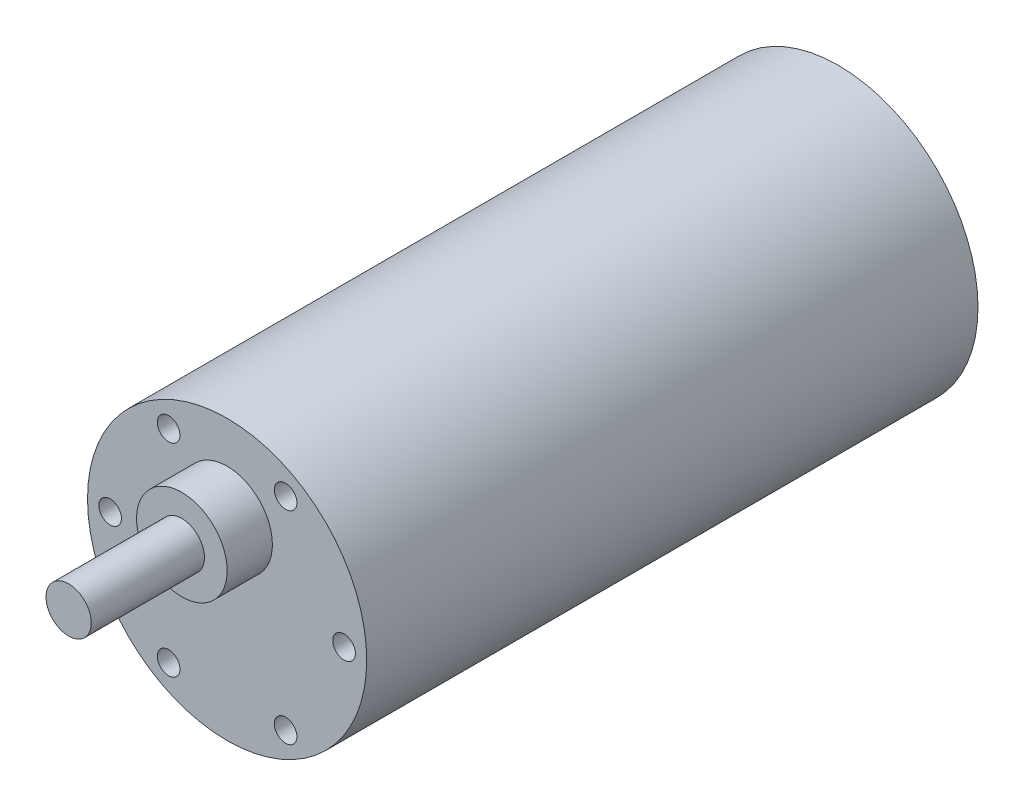
ISO-10303-21;
HEADER;
FILE_DESCRIPTION(('STEP AP214'),'2;1');
FILE_NAME('part.step','',(''),(''),'','','');
FILE_SCHEMA(('AUTOMOTIVE_DESIGN { 1 0 10303 214 1 1 1 1 }'));
ENDSEC;
DATA;
#1=APPLICATION_CONTEXT('core data for automotive mechanical design processes');
#2=APPLICATION_PROTOCOL_DEFINITION('international standard','automotive_design',2000,#1);
#3=PRODUCT_CONTEXT('',#1,'mechanical');
#4=PRODUCT('Part','Part','',(#3));
#5=PRODUCT_RELATED_PRODUCT_CATEGORY('part','',(#4));
#6=PRODUCT_DEFINITION_FORMATION('','',#4);
#7=PRODUCT_DEFINITION_CONTEXT('part definition',#1,'design');
#8=PRODUCT_DEFINITION('design','',#6,#7);
#9=PRODUCT_DEFINITION_SHAPE('','',#8);
#10=(LENGTH_UNIT() NAMED_UNIT(*) SI_UNIT(.MILLI.,.METRE.));
#11=(NAMED_UNIT(*) PLANE_ANGLE_UNIT() SI_UNIT($,.RADIAN.));
#12=(NAMED_UNIT(*) SI_UNIT($,.STERADIAN.) SOLID_ANGLE_UNIT());
#13=UNCERTAINTY_MEASURE_WITH_UNIT(LENGTH_MEASURE(1.E-05),#10,'distance_accuracy_value','');
#14=(GEOMETRIC_REPRESENTATION_CONTEXT(3) GLOBAL_UNCERTAINTY_ASSIGNED_CONTEXT((#13)) GLOBAL_UNIT_ASSIGNED_CONTEXT((#10,
#11,#12)) REPRESENTATION_CONTEXT('',''));
#15=CARTESIAN_POINT('',(0.,0.,0.));
#16=DIRECTION('',(0.,0.,1.));
#17=DIRECTION('',(1.,0.,0.));
#18=AXIS2_PLACEMENT_3D('',#15,#16,#17);
#19=CARTESIAN_POINT('',(0.,0.,24.));
#20=DIRECTION('',(0.,0.,-1.));
#21=DIRECTION('',(-1.,0.,0.));
#22=AXIS2_PLACEMENT_3D('',#19,#20,#21);
#23=CYLINDRICAL_SURFACE('',#22,18.5);
#24=CARTESIAN_POINT('',(0.,0.,24.));
#25=DIRECTION('',(0.,0.,1.));
#26=DIRECTION('',(1.,0.,0.));
#27=AXIS2_PLACEMENT_3D('',#24,#25,#26);
#28=CIRCLE('',#27,18.5);
#29=CARTESIAN_POINT('',(18.5,0.,24.));
#30=VERTEX_POINT('',#29);
#31=EDGE_CURVE('E10',#30,#30,#28,.T.);
#32=ORIENTED_EDGE('',*,*,#31,.F.);
#33=EDGE_LOOP('',(#32));
#34=FACE_BOUND('',#33,.T.);
#35=CARTESIAN_POINT('',(0.,0.,-57.));
#36=DIRECTION('',(0.,0.,1.));
#37=DIRECTION('',(1.,0.,0.));
#38=AXIS2_PLACEMENT_3D('',#35,#36,#37);
#39=CIRCLE('',#38,18.5);
#40=CARTESIAN_POINT('',(18.5,0.,-57.));
#41=VERTEX_POINT('',#40);
#42=EDGE_CURVE('E44',#41,#41,#39,.T.);
#43=ORIENTED_EDGE('',*,*,#42,.T.);
#44=EDGE_LOOP('',(#43));
#45=FACE_BOUND('',#44,.T.);
#46=ADVANCED_FACE('F37',(#34,#45),#23,.T.);
#47=CARTESIAN_POINT('',(0.,0.,24.));
#48=DIRECTION('',(0.,0.,1.));
#49=DIRECTION('',(1.,0.,0.));
#50=AXIS2_PLACEMENT_3D('',#47,#48,#49);
#51=PLANE('',#50);
#52=CARTESIAN_POINT('',(0.,7.,24.));
#53=DIRECTION('',(0.,0.,1.));
#54=DIRECTION('',(1.,0.,0.));
#55=AXIS2_PLACEMENT_3D('',#52,#53,#54);
#56=CIRCLE('',#55,6.);
#57=CARTESIAN_POINT('',(6.,7.,24.));
#58=VERTEX_POINT('',#57);
#59=EDGE_CURVE('E101',#58,#58,#56,.T.);
#60=ORIENTED_EDGE('',*,*,#59,.F.);
#61=EDGE_LOOP('',(#60));
#62=FACE_BOUND('',#61,.T.);
#63=CARTESIAN_POINT('',(15.5,0.,24.));
#64=DIRECTION('',(0.,0.,1.));
#65=DIRECTION('',(1.,0.,0.));
#66=AXIS2_PLACEMENT_3D('',#63,#64,#65);
#67=CIRCLE('',#66,1.5);
#68=CARTESIAN_POINT('',(17.,0.,24.));
#69=VERTEX_POINT('',#68);
#70=EDGE_CURVE('E54',#69,#69,#67,.T.);
#71=ORIENTED_EDGE('',*,*,#70,.F.);
#72=EDGE_LOOP('',(#71));
#73=FACE_BOUND('',#72,.T.);
#74=CARTESIAN_POINT('',(7.75000000000016,13.4233937586587,24.));
#75=DIRECTION('',(0.,0.,1.));
#76=DIRECTION('',(1.,0.,0.));
#77=AXIS2_PLACEMENT_3D('',#74,#75,#76);
#78=CIRCLE('',#77,1.5);
#79=CARTESIAN_POINT('',(9.25000000000016,13.4233937586587,24.));
#80=VERTEX_POINT('',#79);
#81=EDGE_CURVE('E90',#80,#80,#78,.T.);
#82=ORIENTED_EDGE('',*,*,#81,.F.);
#83=EDGE_LOOP('',(#82));
#84=FACE_BOUND('',#83,.T.);
#85=CARTESIAN_POINT('',(-7.74999999999987,13.4233937586589,24.));
#86=DIRECTION('',(0.,0.,1.));
#87=DIRECTION('',(1.,0.,0.));
#88=AXIS2_PLACEMENT_3D('',#85,#86,#87);
#89=CIRCLE('',#88,1.5);
#90=CARTESIAN_POINT('',(-6.24999999999988,13.4233937586589,24.));
#91=VERTEX_POINT('',#90);
#92=EDGE_CURVE('E57',#91,#91,#89,.T.);
#93=ORIENTED_EDGE('',*,*,#92,.F.);
#94=EDGE_LOOP('',(#93));
#95=FACE_BOUND('',#94,.T.);
#96=CARTESIAN_POINT('',(-15.5,1.08235921504137E-13,24.));
#97=DIRECTION('',(0.,0.,1.));
#98=DIRECTION('',(1.,0.,0.));
#99=AXIS2_PLACEMENT_3D('',#96,#97,#98);
#100=CIRCLE('',#99,1.5);
#101=CARTESIAN_POINT('',(-14.,1.08235921504137E-13,24.));
#102=VERTEX_POINT('',#101);
#103=EDGE_CURVE('E66',#102,#102,#100,.T.);
#104=ORIENTED_EDGE('',*,*,#103,.F.);
#105=EDGE_LOOP('',(#104));
#106=FACE_BOUND('',#105,.T.);
#107=CARTESIAN_POINT('',(-7.75000000000006,-13.4233937586588,24.));
#108=DIRECTION('',(0.,0.,1.));
#109=DIRECTION('',(1.,0.,0.));
#110=AXIS2_PLACEMENT_3D('',#107,#108,#109);
#111=CIRCLE('',#110,1.5);
#112=CARTESIAN_POINT('',(-6.25000000000006,-13.4233937586588,24.));
#113=VERTEX_POINT('',#112);
#114=EDGE_CURVE('E74',#113,#113,#111,.T.);
#115=ORIENTED_EDGE('',*,*,#114,.F.);
#116=EDGE_LOOP('',(#115));
#117=FACE_BOUND('',#116,.T.);
#118=CARTESIAN_POINT('',(7.74999999999997,-13.4233937586588,24.));
#119=DIRECTION('',(0.,0.,1.));
#120=DIRECTION('',(1.,0.,0.));
#121=AXIS2_PLACEMENT_3D('',#118,#119,#120);
#122=CIRCLE('',#121,1.5);
#123=CARTESIAN_POINT('',(9.24999999999997,-13.4233937586588,24.));
#124=VERTEX_POINT('',#123);
#125=EDGE_CURVE('E82',#124,#124,#122,.T.);
#126=ORIENTED_EDGE('',*,*,#125,.F.);
#127=EDGE_LOOP('',(#126));
#128=FACE_BOUND('',#127,.T.);
#129=ORIENTED_EDGE('',*,*,#31,.T.);
#130=EDGE_LOOP('',(#129));
#131=FACE_BOUND('',#130,.T.);
#132=ADVANCED_FACE('F134',(#62,#73,#84,#95,#106,#117,#128,#131),#51,.T.);
#133=CARTESIAN_POINT('',(0.,0.,-57.));
#134=DIRECTION('',(0.,0.,1.));
#135=DIRECTION('',(1.,0.,0.));
#136=AXIS2_PLACEMENT_3D('',#133,#134,#135);
#137=PLANE('',#136);
#138=ORIENTED_EDGE('',*,*,#42,.F.);
#139=EDGE_LOOP('',(#138));
#140=FACE_BOUND('',#139,.T.);
#141=ADVANCED_FACE('F139',(#140),#137,.F.);
#142=CARTESIAN_POINT('',(7.74999999999997,-13.4233937586588,19.));
#143=DIRECTION('',(0.,0.,1.));
#144=DIRECTION('',(1.,0.,0.));
#145=AXIS2_PLACEMENT_3D('',#142,#143,#144);
#146=CYLINDRICAL_SURFACE('',#145,1.5);
#147=CARTESIAN_POINT('',(7.74999999999997,-13.4233937586588,19.));
#148=DIRECTION('',(0.,0.,1.));
#149=DIRECTION('',(1.,0.,0.));
#150=AXIS2_PLACEMENT_3D('',#147,#148,#149);
#151=CIRCLE('',#150,1.5);
#152=CARTESIAN_POINT('',(9.24999999999997,-13.4233937586588,19.));
#153=VERTEX_POINT('',#152);
#154=EDGE_CURVE('E86',#153,#153,#151,.T.);
#155=ORIENTED_EDGE('',*,*,#154,.F.);
#156=EDGE_LOOP('',(#155));
#157=FACE_BOUND('',#156,.T.);
#158=ORIENTED_EDGE('',*,*,#125,.T.);
#159=EDGE_LOOP('',(#158));
#160=FACE_BOUND('',#159,.T.);
#161=ADVANCED_FACE('F144',(#157,#160),#146,.F.);
#162=CARTESIAN_POINT('',(7.74999999999997,-13.4233937586588,19.));
#163=DIRECTION('',(0.,0.,1.));
#164=DIRECTION('',(1.,0.,0.));
#165=AXIS2_PLACEMENT_3D('',#162,#163,#164);
#166=PLANE('',#165);
#167=ORIENTED_EDGE('',*,*,#154,.T.);
#168=EDGE_LOOP('',(#167));
#169=FACE_BOUND('',#168,.T.);
#170=ADVANCED_FACE('F171',(#169),#166,.T.);
#171=CARTESIAN_POINT('',(-7.75000000000006,-13.4233937586588,19.));
#172=DIRECTION('',(0.,0.,1.));
#173=DIRECTION('',(1.,0.,0.));
#174=AXIS2_PLACEMENT_3D('',#171,#172,#173);
#175=CYLINDRICAL_SURFACE('',#174,1.5);
#176=CARTESIAN_POINT('',(-7.75000000000006,-13.4233937586588,19.));
#177=DIRECTION('',(0.,0.,1.));
#178=DIRECTION('',(1.,0.,0.));
#179=AXIS2_PLACEMENT_3D('',#176,#177,#178);
#180=CIRCLE('',#179,1.5);
#181=CARTESIAN_POINT('',(-6.25000000000006,-13.4233937586588,19.));
#182=VERTEX_POINT('',#181);
#183=EDGE_CURVE('E78',#182,#182,#180,.T.);
#184=ORIENTED_EDGE('',*,*,#183,.F.);
#185=EDGE_LOOP('',(#184));
#186=FACE_BOUND('',#185,.T.);
#187=ORIENTED_EDGE('',*,*,#114,.T.);
#188=EDGE_LOOP('',(#187));
#189=FACE_BOUND('',#188,.T.);
#190=ADVANCED_FACE('F168',(#186,#189),#175,.F.);
#191=CARTESIAN_POINT('',(-7.75000000000006,-13.4233937586588,19.));
#192=DIRECTION('',(0.,0.,1.));
#193=DIRECTION('',(1.,0.,0.));
#194=AXIS2_PLACEMENT_3D('',#191,#192,#193);
#195=PLANE('',#194);
#196=ORIENTED_EDGE('',*,*,#183,.T.);
#197=EDGE_LOOP('',(#196));
#198=FACE_BOUND('',#197,.T.);
#199=ADVANCED_FACE('F163',(#198),#195,.T.);
#200=CARTESIAN_POINT('',(-15.5,1.08235921504137E-13,19.));
#201=DIRECTION('',(0.,0.,1.));
#202=DIRECTION('',(1.,0.,0.));
#203=AXIS2_PLACEMENT_3D('',#200,#201,#202);
#204=CYLINDRICAL_SURFACE('',#203,1.5);
#205=CARTESIAN_POINT('',(-15.5,1.08235921504137E-13,19.));
#206=DIRECTION('',(0.,0.,1.));
#207=DIRECTION('',(1.,0.,0.));
#208=AXIS2_PLACEMENT_3D('',#205,#206,#207);
#209=CIRCLE('',#208,1.5);
#210=CARTESIAN_POINT('',(-14.,1.08235921504137E-13,19.));
#211=VERTEX_POINT('',#210);
#212=EDGE_CURVE('E70',#211,#211,#209,.T.);
#213=ORIENTED_EDGE('',*,*,#212,.F.);
#214=EDGE_LOOP('',(#213));
#215=FACE_BOUND('',#214,.T.);
#216=ORIENTED_EDGE('',*,*,#103,.T.);
#217=EDGE_LOOP('',(#216));
#218=FACE_BOUND('',#217,.T.);
#219=ADVANCED_FACE('F160',(#215,#218),#204,.F.);
#220=CARTESIAN_POINT('',(-15.5,1.08235921504137E-13,19.));
#221=DIRECTION('',(0.,0.,1.));
#222=DIRECTION('',(1.,0.,0.));
#223=AXIS2_PLACEMENT_3D('',#220,#221,#222);
#224=PLANE('',#223);
#225=ORIENTED_EDGE('',*,*,#212,.T.);
#226=EDGE_LOOP('',(#225));
#227=FACE_BOUND('',#226,.T.);
#228=ADVANCED_FACE('F154',(#227),#224,.T.);
#229=CARTESIAN_POINT('',(-7.74999999999987,13.4233937586589,19.));
#230=DIRECTION('',(0.,0.,1.));
#231=DIRECTION('',(1.,0.,0.));
#232=AXIS2_PLACEMENT_3D('',#229,#230,#231);
#233=CYLINDRICAL_SURFACE('',#232,1.5);
#234=CARTESIAN_POINT('',(-7.74999999999987,13.4233937586589,19.));
#235=DIRECTION('',(0.,0.,1.));
#236=DIRECTION('',(1.,0.,0.));
#237=AXIS2_PLACEMENT_3D('',#234,#235,#236);
#238=CIRCLE('',#237,1.5);
#239=CARTESIAN_POINT('',(-6.24999999999988,13.4233937586589,19.));
#240=VERTEX_POINT('',#239);
#241=EDGE_CURVE('E61',#240,#240,#238,.T.);
#242=ORIENTED_EDGE('',*,*,#241,.F.);
#243=EDGE_LOOP('',(#242));
#244=FACE_BOUND('',#243,.T.);
#245=ORIENTED_EDGE('',*,*,#92,.T.);
#246=EDGE_LOOP('',(#245));
#247=FACE_BOUND('',#246,.T.);
#248=ADVANCED_FACE('F150',(#244,#247),#233,.F.);
#249=CARTESIAN_POINT('',(-7.74999999999987,13.4233937586589,19.));
#250=DIRECTION('',(0.,0.,1.));
#251=DIRECTION('',(1.,0.,0.));
#252=AXIS2_PLACEMENT_3D('',#249,#250,#251);
#253=PLANE('',#252);
#254=ORIENTED_EDGE('',*,*,#241,.T.);
#255=EDGE_LOOP('',(#254));
#256=FACE_BOUND('',#255,.T.);
#257=ADVANCED_FACE('F153',(#256),#253,.T.);
#258=CARTESIAN_POINT('',(7.75000000000016,13.4233937586587,19.));
#259=DIRECTION('',(0.,0.,1.));
#260=DIRECTION('',(1.,0.,0.));
#261=AXIS2_PLACEMENT_3D('',#258,#259,#260);
#262=CYLINDRICAL_SURFACE('',#261,1.5);
#263=CARTESIAN_POINT('',(7.75000000000016,13.4233937586587,19.));
#264=DIRECTION('',(0.,0.,1.));
#265=DIRECTION('',(1.,0.,0.));
#266=AXIS2_PLACEMENT_3D('',#263,#264,#265);
#267=CIRCLE('',#266,1.5);
#268=CARTESIAN_POINT('',(9.25000000000016,13.4233937586587,19.));
#269=VERTEX_POINT('',#268);
#270=EDGE_CURVE('E62',#269,#269,#267,.T.);
#271=ORIENTED_EDGE('',*,*,#270,.F.);
#272=EDGE_LOOP('',(#271));
#273=FACE_BOUND('',#272,.T.);
#274=ORIENTED_EDGE('',*,*,#81,.T.);
#275=EDGE_LOOP('',(#274));
#276=FACE_BOUND('',#275,.T.);
#277=ADVANCED_FACE('F158',(#273,#276),#262,.F.);
#278=CARTESIAN_POINT('',(7.75000000000016,13.4233937586587,19.));
#279=DIRECTION('',(0.,0.,1.));
#280=DIRECTION('',(1.,0.,0.));
#281=AXIS2_PLACEMENT_3D('',#278,#279,#280);
#282=PLANE('',#281);
#283=ORIENTED_EDGE('',*,*,#270,.T.);
#284=EDGE_LOOP('',(#283));
#285=FACE_BOUND('',#284,.T.);
#286=ADVANCED_FACE('F184',(#285),#282,.T.);
#287=CARTESIAN_POINT('',(15.5,0.,19.));
#288=DIRECTION('',(0.,0.,1.));
#289=DIRECTION('',(1.,0.,0.));
#290=AXIS2_PLACEMENT_3D('',#287,#288,#289);
#291=CYLINDRICAL_SURFACE('',#290,1.5);
#292=CARTESIAN_POINT('',(15.5,0.,19.));
#293=DIRECTION('',(0.,0.,1.));
#294=DIRECTION('',(1.,0.,0.));
#295=AXIS2_PLACEMENT_3D('',#292,#293,#294);
#296=CIRCLE('',#295,1.5);
#297=CARTESIAN_POINT('',(17.,0.,19.));
#298=VERTEX_POINT('',#297);
#299=EDGE_CURVE('E49',#298,#298,#296,.T.);
#300=ORIENTED_EDGE('',*,*,#299,.F.);
#301=EDGE_LOOP('',(#300));
#302=FACE_BOUND('',#301,.T.);
#303=ORIENTED_EDGE('',*,*,#70,.T.);
#304=EDGE_LOOP('',(#303));
#305=FACE_BOUND('',#304,.T.);
#306=ADVANCED_FACE('F188',(#302,#305),#291,.F.);
#307=CARTESIAN_POINT('',(15.5,0.,19.));
#308=DIRECTION('',(0.,0.,1.));
#309=DIRECTION('',(1.,0.,0.));
#310=AXIS2_PLACEMENT_3D('',#307,#308,#309);
#311=PLANE('',#310);
#312=ORIENTED_EDGE('',*,*,#299,.T.);
#313=EDGE_LOOP('',(#312));
#314=FACE_BOUND('',#313,.T.);
#315=ADVANCED_FACE('F192',(#314),#311,.T.);
#316=CARTESIAN_POINT('',(0.,7.,30.));
#317=DIRECTION('',(0.,0.,1.));
#318=DIRECTION('',(1.,0.,0.));
#319=AXIS2_PLACEMENT_3D('',#316,#317,#318);
#320=PLANE('',#319);
#321=CARTESIAN_POINT('',(0.,7.,30.));
#322=DIRECTION('',(0.,0.,1.));
#323=DIRECTION('',(1.,0.,0.));
#324=AXIS2_PLACEMENT_3D('',#321,#322,#323);
#325=CIRCLE('',#324,6.);
#326=CARTESIAN_POINT('',(6.,7.,30.));
#327=VERTEX_POINT('',#326);
#328=EDGE_CURVE('E94',#327,#327,#325,.T.);
#329=ORIENTED_EDGE('',*,*,#328,.T.);
#330=EDGE_LOOP('',(#329));
#331=FACE_BOUND('',#330,.T.);
#332=CARTESIAN_POINT('',(0.,7.,30.));
#333=DIRECTION('',(0.,0.,1.));
#334=DIRECTION('',(1.,0.,0.));
#335=AXIS2_PLACEMENT_3D('',#332,#333,#334);
#336=CIRCLE('',#335,3.);
#337=CARTESIAN_POINT('',(-3.,7.,30.));
#338=VERTEX_POINT('',#337);
#339=EDGE_CURVE('E105',#338,#338,#336,.T.);
#340=ORIENTED_EDGE('',*,*,#339,.F.);
#341=EDGE_LOOP('',(#340));
#342=FACE_BOUND('',#341,.T.);
#343=ADVANCED_FACE('F129',(#331,#342),#320,.T.);
#344=CARTESIAN_POINT('',(0.,7.,30.));
#345=DIRECTION('',(0.,0.,-1.));
#346=DIRECTION('',(-1.,0.,0.));
#347=AXIS2_PLACEMENT_3D('',#344,#345,#346);
#348=CYLINDRICAL_SURFACE('',#347,6.);
#349=ORIENTED_EDGE('',*,*,#328,.F.);
#350=EDGE_LOOP('',(#349));
#351=FACE_BOUND('',#350,.T.);
#352=ORIENTED_EDGE('',*,*,#59,.T.);
#353=EDGE_LOOP('',(#352));
#354=FACE_BOUND('',#353,.T.);
#355=ADVANCED_FACE('F121',(#351,#354),#348,.T.);
#356=CARTESIAN_POINT('',(0.,7.,45.));
#357=DIRECTION('',(0.,0.,-1.));
#358=DIRECTION('',(-1.,0.,0.));
#359=AXIS2_PLACEMENT_3D('',#356,#357,#358);
#360=CYLINDRICAL_SURFACE('',#359,3.);
#361=CARTESIAN_POINT('',(0.,7.,45.));
#362=DIRECTION('',(0.,0.,1.));
#363=DIRECTION('',(1.,0.,0.));
#364=AXIS2_PLACEMENT_3D('',#361,#362,#363);
#365=CIRCLE('',#364,3.);
#366=CARTESIAN_POINT('',(-3.,7.,45.));
#367=VERTEX_POINT('',#366);
#368=EDGE_CURVE('E112',#367,#367,#365,.T.);
#369=CARTESIAN_POINT('',(-3.,7.,30.));
#370=CARTESIAN_POINT('',(-3.,7.,30.15625));
#371=CARTESIAN_POINT('',(-3.,7.,30.3125));
#372=CARTESIAN_POINT('',(-3.,7.,30.625));
#373=CARTESIAN_POINT('',(-3.,7.,30.78125));
#374=CARTESIAN_POINT('',(-3.,7.,31.09375));
#375=CARTESIAN_POINT('',(-3.,7.,31.25));
#376=CARTESIAN_POINT('',(-3.,7.,31.5625));
#377=CARTESIAN_POINT('',(-3.,7.,31.71875));
#378=CARTESIAN_POINT('',(-3.,7.,32.03125));
#379=CARTESIAN_POINT('',(-3.,7.,32.1875));
#380=CARTESIAN_POINT('',(-3.,7.,32.5));
#381=CARTESIAN_POINT('',(-3.,7.,32.65625));
#382=CARTESIAN_POINT('',(-3.,7.,32.96875));
#383=CARTESIAN_POINT('',(-3.,7.,33.125));
#384=CARTESIAN_POINT('',(-3.,7.,33.4375));
#385=CARTESIAN_POINT('',(-3.,7.,33.59375));
#386=CARTESIAN_POINT('',(-3.,7.,33.90625));
#387=CARTESIAN_POINT('',(-3.,7.,34.0625));
#388=CARTESIAN_POINT('',(-3.,7.,34.375));
#389=CARTESIAN_POINT('',(-3.,7.,34.53125));
#390=CARTESIAN_POINT('',(-3.,7.,34.84375));
#391=CARTESIAN_POINT('',(-3.,7.,35.));
#392=CARTESIAN_POINT('',(-3.,7.,35.3125));
#393=CARTESIAN_POINT('',(-3.,7.,35.46875));
#394=CARTESIAN_POINT('',(-3.,7.,35.78125));
#395=CARTESIAN_POINT('',(-3.,7.,35.9375));
#396=CARTESIAN_POINT('',(-3.,7.,36.25));
#397=CARTESIAN_POINT('',(-3.,7.,36.40625));
#398=CARTESIAN_POINT('',(-3.,7.,36.71875));
#399=CARTESIAN_POINT('',(-3.,7.,36.875));
#400=CARTESIAN_POINT('',(-3.,7.,37.1875));
#401=CARTESIAN_POINT('',(-3.,7.,37.34375));
#402=CARTESIAN_POINT('',(-3.,7.,37.65625));
#403=CARTESIAN_POINT('',(-3.,7.,37.8125));
#404=CARTESIAN_POINT('',(-3.,7.,38.125));
#405=CARTESIAN_POINT('',(-3.,7.,38.28125));
#406=CARTESIAN_POINT('',(-3.,7.,38.59375));
#407=CARTESIAN_POINT('',(-3.,7.,38.75));
#408=CARTESIAN_POINT('',(-3.,7.,39.0625));
#409=CARTESIAN_POINT('',(-3.,7.,39.21875));
#410=CARTESIAN_POINT('',(-3.,7.,39.53125));
#411=CARTESIAN_POINT('',(-3.,7.,39.6875));
#412=CARTESIAN_POINT('',(-3.,7.,40.));
#413=CARTESIAN_POINT('',(-3.,7.,40.15625));
#414=CARTESIAN_POINT('',(-3.,7.,40.46875));
#415=CARTESIAN_POINT('',(-3.,7.,40.625));
#416=CARTESIAN_POINT('',(-3.,7.,40.9375));
#417=CARTESIAN_POINT('',(-3.,7.,41.09375));
#418=CARTESIAN_POINT('',(-3.,7.,41.40625));
#419=CARTESIAN_POINT('',(-3.,7.,41.5625));
#420=CARTESIAN_POINT('',(-3.,7.,41.875));
#421=CARTESIAN_POINT('',(-3.,7.,42.03125));
#422=CARTESIAN_POINT('',(-3.,7.,42.34375));
#423=CARTESIAN_POINT('',(-3.,7.,42.5));
#424=CARTESIAN_POINT('',(-3.,7.,42.8125));
#425=CARTESIAN_POINT('',(-3.,7.,42.96875));
#426=CARTESIAN_POINT('',(-3.,7.,43.28125));
#427=CARTESIAN_POINT('',(-3.,7.,43.4375));
#428=CARTESIAN_POINT('',(-3.,7.,43.75));
#429=CARTESIAN_POINT('',(-3.,7.,43.90625));
#430=CARTESIAN_POINT('',(-3.,7.,44.21875));
#431=CARTESIAN_POINT('',(-3.,7.,44.375));
#432=CARTESIAN_POINT('',(-3.,7.,44.6875));
#433=CARTESIAN_POINT('',(-3.,7.,44.84375));
#434=CARTESIAN_POINT('',(-3.,7.,45.));
#435=B_SPLINE_CURVE_WITH_KNOTS('',3,(#369,#370,#371,#372,#373,#374,#375,#376,#377,#378,#379,
#380,#381,#382,#383,#384,#385,#386,#387,#388,#389,#390,#391,#392,#393,#394,#395,#396,#397,#398,
#399,#400,#401,#402,#403,#404,#405,#406,#407,#408,#409,#410,#411,#412,#413,#414,#415,#416,#417,
#418,#419,#420,#421,#422,#423,#424,#425,#426,#427,#428,#429,#430,#431,#432,#433,#434),
.UNSPECIFIED.,.F.,.F.,(4,2,2,2,2,2,2,2,2,2,2,2,2,2,2,2,2,2,2,2,2,2,2,2,2,2,2,2,2,2,2,2,4),(0.,
0.468749999999997,0.937500000000001,1.40625,1.875,2.34375,2.8125,3.28125,3.75,4.21875,4.6875,
5.15625,5.625,6.09374999999999,6.5625,7.03125,7.5,7.96875,8.4375,8.90625,9.37499999999999,
9.84375,10.3125,10.78125,11.25,11.71875,12.1875,12.65625,13.125,13.59375,14.0625,14.53125,15.),.UNSPECIFIED.);
#436=EDGE_CURVE('BSEAM119',#338,#367,#435,.T.);
#437=ORIENTED_EDGE('',*,*,#339,.T.);
#438=ORIENTED_EDGE('',*,*,#368,.F.);
#439=ORIENTED_EDGE('',*,*,#436,.T.);
#440=ORIENTED_EDGE('',*,*,#436,.F.);
#441=EDGE_LOOP('',(#437,#439,#438,#440));
#442=FACE_BOUND('',#441,.T.);
#443=ADVANCED_FACE('F119',(#442),#360,.T.);
#444=CARTESIAN_POINT('',(0.,7.,45.));
#445=DIRECTION('',(0.,0.,1.));
#446=DIRECTION('',(1.,0.,0.));
#447=AXIS2_PLACEMENT_3D('',#444,#445,#446);
#448=PLANE('',#447);
#449=ORIENTED_EDGE('',*,*,#368,.T.);
#450=EDGE_LOOP('',(#449));
#451=FACE_BOUND('',#450,.T.);
#452=ADVANCED_FACE('F117',(#451),#448,.T.);
#453=CLOSED_SHELL('',(#46,#132,#141,#161,#170,#190,#199,#219,#228,#248,#257,#277,#286,#306,#315,
#343,#355,#443,#452));
#454=MANIFOLD_SOLID_BREP('B2',#453);
#455=ADVANCED_BREP_SHAPE_REPRESENTATION('',(#18,#454),#14);
#456=SHAPE_DEFINITION_REPRESENTATION(#9,#455);
ENDSEC;
END-ISO-10303-21;
